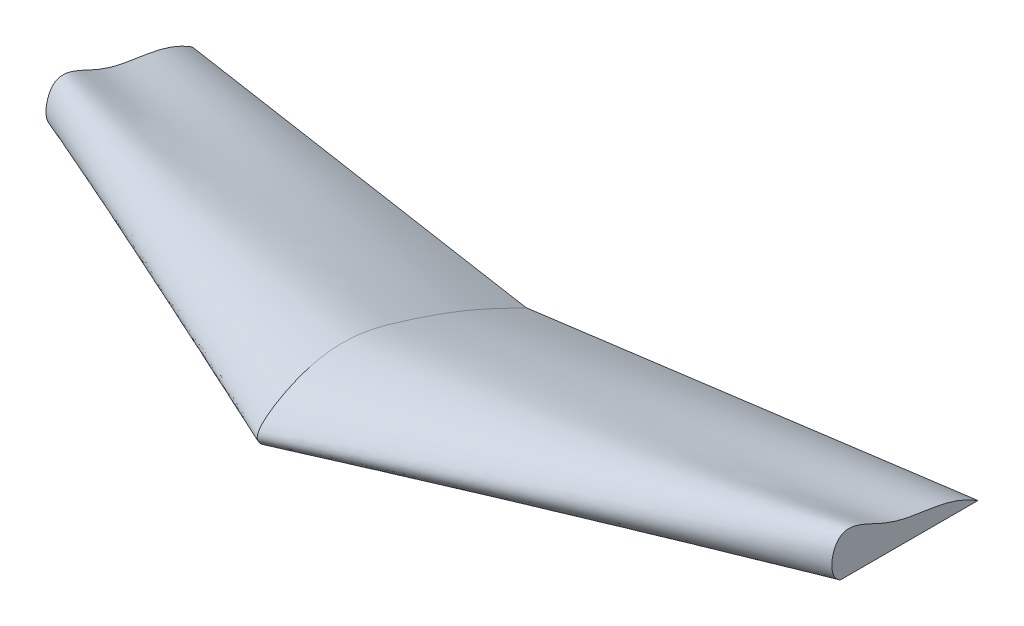
ISO-10303-21;
HEADER;
FILE_DESCRIPTION(('STEP AP214'),'2;1');
FILE_NAME('part.step','',(''),(''),'','','');
FILE_SCHEMA(('AUTOMOTIVE_DESIGN { 1 0 10303 214 1 1 1 1 }'));
ENDSEC;
DATA;
#1=APPLICATION_CONTEXT('core data for automotive mechanical design processes');
#2=APPLICATION_PROTOCOL_DEFINITION('international standard','automotive_design',2000,#1);
#3=PRODUCT_CONTEXT('',#1,'mechanical');
#4=PRODUCT('Part','Part','',(#3));
#5=PRODUCT_RELATED_PRODUCT_CATEGORY('part','',(#4));
#6=PRODUCT_DEFINITION_FORMATION('','',#4);
#7=PRODUCT_DEFINITION_CONTEXT('part definition',#1,'design');
#8=PRODUCT_DEFINITION('design','',#6,#7);
#9=PRODUCT_DEFINITION_SHAPE('','',#8);
#10=(LENGTH_UNIT() NAMED_UNIT(*) SI_UNIT(.MILLI.,.METRE.));
#11=(NAMED_UNIT(*) PLANE_ANGLE_UNIT() SI_UNIT($,.RADIAN.));
#12=(NAMED_UNIT(*) SI_UNIT($,.STERADIAN.) SOLID_ANGLE_UNIT());
#13=UNCERTAINTY_MEASURE_WITH_UNIT(LENGTH_MEASURE(1.E-05),#10,'distance_accuracy_value','');
#14=(GEOMETRIC_REPRESENTATION_CONTEXT(3) GLOBAL_UNCERTAINTY_ASSIGNED_CONTEXT((#13)) GLOBAL_UNIT_ASSIGNED_CONTEXT((#10,
#11,#12)) REPRESENTATION_CONTEXT('',''));
#15=CARTESIAN_POINT('',(0.,0.,0.));
#16=DIRECTION('',(0.,0.,1.));
#17=DIRECTION('',(1.,0.,0.));
#18=AXIS2_PLACEMENT_3D('',#15,#16,#17);
#19=CARTESIAN_POINT('',(254.,16.1852541410817,-133.821404396964));
#20=DIRECTION('',(1.,0.,0.));
#21=DIRECTION('',(0.,0.,-1.));
#22=AXIS2_PLACEMENT_3D('',#19,#20,#21);
#23=PLANE('',#22);
#24=CARTESIAN_POINT('',(254.,0.,-190.5));
#25=CARTESIAN_POINT('',(254.,14.2277517000863,-167.958460840745));
#26=CARTESIAN_POINT('',(254.,6.10613582016415,-144.028888007939));
#27=CARTESIAN_POINT('',(254.,35.9802169390411,-97.7728253748401));
#28=CARTESIAN_POINT('',(254.,4.42097792765258,-92.9952951921213));
#29=CARTESIAN_POINT('',(254.,0.,-101.6));
#30=B_SPLINE_CURVE_WITH_KNOTS('',3,(#24,#25,#26,#27,#28,#29),.UNSPECIFIED.,.F.,.F.,(4,1,1,4),
(0.,0.541765425244721,0.775811509835441,1.),.UNSPECIFIED.);
#31=CARTESIAN_POINT('',(254.,0.,-190.5));
#32=VERTEX_POINT('',#31);
#33=CARTESIAN_POINT('',(254.,0.,-101.6));
#34=VERTEX_POINT('',#33);
#35=EDGE_CURVE('E50',#32,#34,#30,.T.);
#36=ORIENTED_EDGE('',*,*,#35,.T.);
#37=DIRECTION('',(0.,0.,-1.));
#38=VECTOR('',#37,1.);
#39=CARTESIAN_POINT('',(254.,0.,-101.6));
#40=LINE('',#39,#38);
#41=EDGE_CURVE('E11',#34,#32,#40,.T.);
#42=ORIENTED_EDGE('',*,*,#41,.T.);
#43=EDGE_LOOP('',(#36,#42));
#44=FACE_BOUND('',#43,.T.);
#45=ADVANCED_FACE('F47',(#44),#23,.T.);
#46=CARTESIAN_POINT('',(0.,0.,0.));
#47=DIRECTION('',(0.,1.,0.));
#48=DIRECTION('',(0.,0.,1.));
#49=AXIS2_PLACEMENT_3D('',#46,#47,#48);
#50=PLANE('',#49);
#51=DIRECTION('',(0.988936352868297,0.,-0.148340452930245));
#52=VECTOR('',#51,1.);
#53=CARTESIAN_POINT('',(0.,0.,-152.4));
#54=LINE('',#53,#52);
#55=CARTESIAN_POINT('',(0.,0.,-152.4));
#56=VERTEX_POINT('',#55);
#57=EDGE_CURVE('E95',#56,#32,#54,.T.);
#58=ORIENTED_EDGE('',*,*,#57,.T.);
#59=ORIENTED_EDGE('',*,*,#41,.F.);
#60=DIRECTION('',(0.928476690885259,0.,-0.371390676354104));
#61=VECTOR('',#60,1.);
#62=CARTESIAN_POINT('',(0.,0.,0.));
#63=LINE('',#62,#61);
#64=CARTESIAN_POINT('',(0.,0.,0.));
#65=VERTEX_POINT('',#64);
#66=EDGE_CURVE('E67',#65,#34,#63,.T.);
#67=ORIENTED_EDGE('',*,*,#66,.F.);
#68=DIRECTION('',(-0.928476690885259,0.,-0.371390676354104));
#69=VECTOR('',#68,1.);
#70=CARTESIAN_POINT('',(0.,0.,0.));
#71=LINE('',#70,#69);
#72=CARTESIAN_POINT('',(-254.,0.,-101.6));
#73=VERTEX_POINT('',#72);
#74=EDGE_CURVE('E81',#65,#73,#71,.T.);
#75=ORIENTED_EDGE('',*,*,#74,.T.);
#76=DIRECTION('',(0.,0.,-1.));
#77=VECTOR('',#76,1.);
#78=CARTESIAN_POINT('',(-254.,0.,-101.6));
#79=LINE('',#78,#77);
#80=CARTESIAN_POINT('',(-254.,0.,-190.5));
#81=VERTEX_POINT('',#80);
#82=EDGE_CURVE('E96',#73,#81,#79,.T.);
#83=ORIENTED_EDGE('',*,*,#82,.T.);
#84=DIRECTION('',(-0.988936352868297,0.,-0.148340452930245));
#85=VECTOR('',#84,1.);
#86=CARTESIAN_POINT('',(0.,0.,-152.4));
#87=LINE('',#86,#85);
#88=EDGE_CURVE('E90',#56,#81,#87,.T.);
#89=ORIENTED_EDGE('',*,*,#88,.F.);
#90=EDGE_LOOP('',(#58,#59,#67,#75,#83,#89));
#91=FACE_BOUND('',#90,.T.);
#92=ADVANCED_FACE('F98',(#91),#50,.F.);
#93=CARTESIAN_POINT('',(0.,0.,-152.4));
#94=CARTESIAN_POINT('',(254.,0.,-190.5));
#95=CARTESIAN_POINT('',(0.,6.75774499343813,-138.431117568751));
#96=CARTESIAN_POINT('',(254.,5.75921434204525,-181.375469409761));
#97=CARTESIAN_POINT('',(0.,18.7176385133939,-113.708914136579));
#98=CARTESIAN_POINT('',(254.,10.1813680912743,-166.917748750834));
#99=CARTESIAN_POINT('',(0.,31.1051097645505,-77.1028177076288));
#100=CARTESIAN_POINT('',(254.,12.294957651276,-147.532126851356));
#101=CARTESIAN_POINT('',(0.,41.6325424930729,-42.1778806265753));
#102=CARTESIAN_POINT('',(254.,17.4207990184289,-127.187430322153));
#103=CARTESIAN_POINT('',(0.,39.5392488153743,-14.3896126923796));
#104=CARTESIAN_POINT('',(254.,28.4216577966255,-109.476254300948));
#105=CARTESIAN_POINT('',(0.,25.5859715605385,13.1799306155882));
#106=CARTESIAN_POINT('',(254.,23.5605676863605,-99.2420953069157));
#107=CARTESIAN_POINT('',(0.,11.7743830972059,29.8908383343079));
#108=CARTESIAN_POINT('',(254.,12.6484872597338,-94.2407996907701));
#109=CARTESIAN_POINT('',(0.,4.09308659499127,10.3908449970716));
#110=CARTESIAN_POINT('',(254.,2.3557801065497,-97.0148623356967));
#111=CARTESIAN_POINT('',(0.,0.,0.));
#112=CARTESIAN_POINT('',(254.,0.,-101.6));
#113=B_SPLINE_SURFACE_WITH_KNOTS('',3,1,((#93,#94),(#95,#96),(#97,#98),(#99,#100),(#101,#102),
(#103,#104),(#105,#106),(#107,#108),(#109,#110),(#111,#112)),.UNSPECIFIED.,.F.,.F.,.F.,(4,1,1,1,
1,1,1,4),(2,2),(0.,0.219299807366945,0.388117981309187,0.541765425244721,0.746986054153829,
0.775811509835441,0.880538018083364,1.),(0.,1.),.UNSPECIFIED.);
#114=CARTESIAN_POINT('',(0.,0.,-152.4));
#115=CARTESIAN_POINT('',(0.,6.75774499343813,-138.431117568751));
#116=CARTESIAN_POINT('',(0.,18.7176385133939,-113.708914136579));
#117=CARTESIAN_POINT('',(0.,35.7974812639085,-63.2364360948428));
#118=CARTESIAN_POINT('',(0.,47.7626807539698,-20.0544012790023));
#119=CARTESIAN_POINT('',(0.,12.7620202044427,32.3980865579863));
#120=CARTESIAN_POINT('',(0.,4.09308659499127,10.3908449970716));
#121=CARTESIAN_POINT('',(0.,0.,0.));
#122=B_SPLINE_CURVE_WITH_KNOTS('',3,(#114,#115,#116,#117,#118,#119,#120,#121),.UNSPECIFIED.,.F.,
.F.,(4,1,1,1,1,4),(0.,0.219299807366945,0.388117981309187,0.746986054153829,0.880538018083364,
1.),.UNSPECIFIED.);
#123=EDGE_CURVE('E83',#56,#65,#122,.T.);
#124=ORIENTED_EDGE('',*,*,#123,.T.);
#125=ORIENTED_EDGE('',*,*,#66,.T.);
#126=ORIENTED_EDGE('',*,*,#35,.F.);
#127=ORIENTED_EDGE('',*,*,#57,.F.);
#128=EDGE_LOOP('',(#124,#125,#126,#127));
#129=FACE_BOUND('',#128,.T.);
#130=ADVANCED_FACE('F93',(#129),#113,.T.);
#131=CARTESIAN_POINT('',(-254.,16.1852541410817,-133.821404396964));
#132=DIRECTION('',(-1.,0.,0.));
#133=DIRECTION('',(0.,0.,-1.));
#134=AXIS2_PLACEMENT_3D('',#131,#132,#133);
#135=PLANE('',#134);
#136=CARTESIAN_POINT('',(-254.,0.,-190.5));
#137=CARTESIAN_POINT('',(-254.,14.2277517000863,-167.958460840745));
#138=CARTESIAN_POINT('',(-254.,6.10613582016415,-144.028888007939));
#139=CARTESIAN_POINT('',(-254.,35.9802169390411,-97.7728253748401));
#140=CARTESIAN_POINT('',(-254.,4.42097792765258,-92.9952951921213));
#141=CARTESIAN_POINT('',(-254.,0.,-101.6));
#142=B_SPLINE_CURVE_WITH_KNOTS('',3,(#136,#137,#138,#139,#140,#141),.UNSPECIFIED.,.F.,.F.,(4,1,
1,4),(0.,0.541765425244721,0.775811509835441,1.),.UNSPECIFIED.);
#143=EDGE_CURVE('E86',#81,#73,#142,.T.);
#144=ORIENTED_EDGE('',*,*,#143,.F.);
#145=ORIENTED_EDGE('',*,*,#82,.F.);
#146=EDGE_LOOP('',(#144,#145));
#147=FACE_BOUND('',#146,.T.);
#148=ADVANCED_FACE('F115',(#147),#135,.T.);
#149=CARTESIAN_POINT('',(0.,0.,-152.4));
#150=CARTESIAN_POINT('',(-254.,0.,-190.5));
#151=CARTESIAN_POINT('',(0.,6.75774499343813,-138.431117568751));
#152=CARTESIAN_POINT('',(-254.,5.75921434204525,-181.375469409761));
#153=CARTESIAN_POINT('',(0.,18.7176385133939,-113.708914136579));
#154=CARTESIAN_POINT('',(-254.,10.1813680912743,-166.917748750834));
#155=CARTESIAN_POINT('',(0.,31.1051097645505,-77.1028177076288));
#156=CARTESIAN_POINT('',(-254.,12.294957651276,-147.532126851356));
#157=CARTESIAN_POINT('',(0.,41.6325424930729,-42.1778806265753));
#158=CARTESIAN_POINT('',(-254.,17.4207990184289,-127.187430322153));
#159=CARTESIAN_POINT('',(0.,39.5392488153743,-14.3896126923796));
#160=CARTESIAN_POINT('',(-254.,28.4216577966255,-109.476254300948));
#161=CARTESIAN_POINT('',(0.,25.5859715605385,13.1799306155882));
#162=CARTESIAN_POINT('',(-254.,23.5605676863605,-99.2420953069157));
#163=CARTESIAN_POINT('',(0.,11.7743830972059,29.8908383343079));
#164=CARTESIAN_POINT('',(-254.,12.6484872597338,-94.2407996907701));
#165=CARTESIAN_POINT('',(0.,4.09308659499127,10.3908449970716));
#166=CARTESIAN_POINT('',(-254.,2.3557801065497,-97.0148623356967));
#167=CARTESIAN_POINT('',(0.,0.,0.));
#168=CARTESIAN_POINT('',(-254.,0.,-101.6));
#169=B_SPLINE_SURFACE_WITH_KNOTS('',3,1,((#149,#150),(#151,#152),(#153,#154),(#155,#156),(#157,
#158),(#159,#160),(#161,#162),(#163,#164),(#165,#166),(#167,#168)),.UNSPECIFIED.,.F.,.F.,.F.,(4,
1,1,1,1,1,1,4),(2,2),(0.,0.219299807366945,0.388117981309187,0.541765425244721,
0.746986054153829,0.775811509835441,0.880538018083364,1.),(0.,1.),.UNSPECIFIED.);
#170=ORIENTED_EDGE('',*,*,#123,.F.);
#171=ORIENTED_EDGE('',*,*,#88,.T.);
#172=ORIENTED_EDGE('',*,*,#143,.T.);
#173=ORIENTED_EDGE('',*,*,#74,.F.);
#174=EDGE_LOOP('',(#170,#171,#172,#173));
#175=FACE_BOUND('',#174,.T.);
#176=ADVANCED_FACE('F82',(#175),#169,.F.);
#177=CLOSED_SHELL('',(#45,#92,#130,#148,#176));
#178=MANIFOLD_SOLID_BREP('B2',#177);
#179=ADVANCED_BREP_SHAPE_REPRESENTATION('',(#18,#178),#14);
#180=SHAPE_DEFINITION_REPRESENTATION(#9,#179);
ENDSEC;
END-ISO-10303-21;
